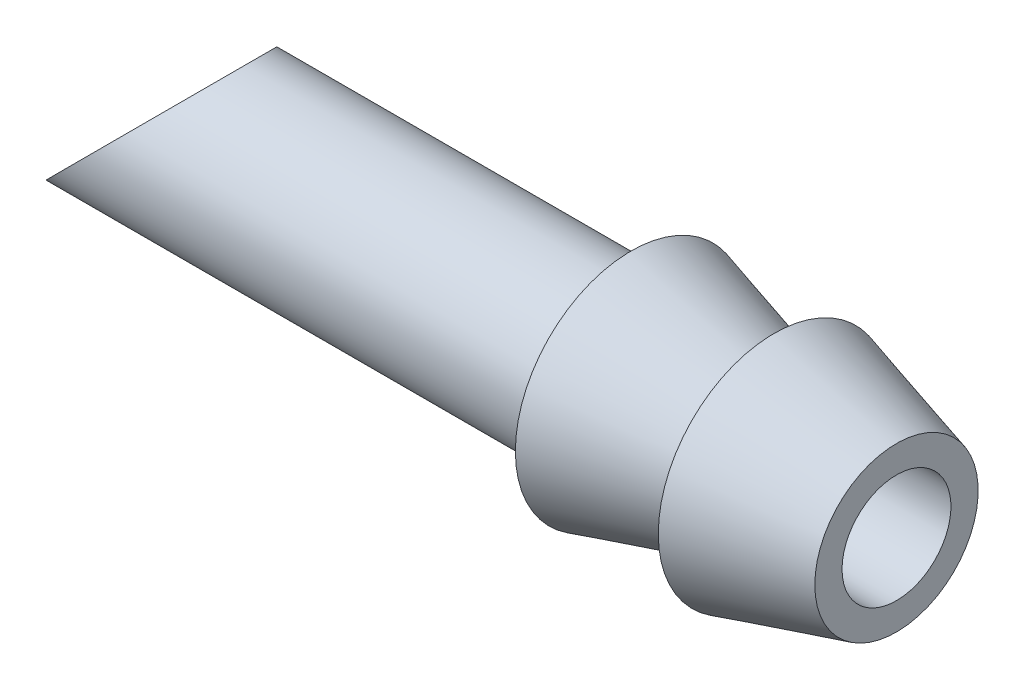
ISO-10303-21;
HEADER;
FILE_DESCRIPTION(('STEP AP214'),'2;1');
FILE_NAME('part.step','',(''),(''),'','','');
FILE_SCHEMA(('AUTOMOTIVE_DESIGN { 1 0 10303 214 1 1 1 1 }'));
ENDSEC;
DATA;
#1=APPLICATION_CONTEXT('core data for automotive mechanical design processes');
#2=APPLICATION_PROTOCOL_DEFINITION('international standard','automotive_design',2000,#1);
#3=PRODUCT_CONTEXT('',#1,'mechanical');
#4=PRODUCT('Part','Part','',(#3));
#5=PRODUCT_RELATED_PRODUCT_CATEGORY('part','',(#4));
#6=PRODUCT_DEFINITION_FORMATION('','',#4);
#7=PRODUCT_DEFINITION_CONTEXT('part definition',#1,'design');
#8=PRODUCT_DEFINITION('design','',#6,#7);
#9=PRODUCT_DEFINITION_SHAPE('','',#8);
#10=(LENGTH_UNIT() NAMED_UNIT(*) SI_UNIT(.MILLI.,.METRE.));
#11=(NAMED_UNIT(*) PLANE_ANGLE_UNIT() SI_UNIT($,.RADIAN.));
#12=(NAMED_UNIT(*) SI_UNIT($,.STERADIAN.) SOLID_ANGLE_UNIT());
#13=UNCERTAINTY_MEASURE_WITH_UNIT(LENGTH_MEASURE(1.E-05),#10,'distance_accuracy_value','');
#14=(GEOMETRIC_REPRESENTATION_CONTEXT(3) GLOBAL_UNCERTAINTY_ASSIGNED_CONTEXT((#13)) GLOBAL_UNIT_ASSIGNED_CONTEXT((#10,
#11,#12)) REPRESENTATION_CONTEXT('',''));
#15=CARTESIAN_POINT('',(0.,0.,0.));
#16=DIRECTION('',(0.,0.,1.));
#17=DIRECTION('',(1.,0.,0.));
#18=AXIS2_PLACEMENT_3D('',#15,#16,#17);
#19=CARTESIAN_POINT('',(0.,0.,0.));
#20=DIRECTION('',(-1.,0.,0.));
#21=DIRECTION('',(0.,0.,1.));
#22=AXIS2_PLACEMENT_3D('',#19,#20,#21);
#23=CYLINDRICAL_SURFACE('',#22,3.);
#24=CARTESIAN_POINT('',(2.99999999999997,0.,0.));
#25=DIRECTION('',(0.707106781186551,-0.707106781186544,0.));
#26=DIRECTION('',(-0.707106781186544,-0.707106781186551,0.));
#27=AXIS2_PLACEMENT_3D('',#24,#25,#26);
#28=ELLIPSE('',#27,4.24264068711926,3.);
#29=CARTESIAN_POINT('',(0.,-3.,0.));
#30=VERTEX_POINT('',#29);
#31=EDGE_CURVE('E72',#30,#30,#28,.T.);
#32=ORIENTED_EDGE('',*,*,#31,.T.);
#33=EDGE_LOOP('',(#32));
#34=FACE_BOUND('',#33,.T.);
#35=CARTESIAN_POINT('',(20.25,0.,0.));
#36=DIRECTION('',(-1.,0.,0.));
#37=DIRECTION('',(0.,0.,1.));
#38=AXIS2_PLACEMENT_3D('',#35,#36,#37);
#39=CIRCLE('',#38,3.);
#40=CARTESIAN_POINT('',(20.25,0.,3.));
#41=VERTEX_POINT('',#40);
#42=EDGE_CURVE('E68',#41,#41,#39,.T.);
#43=ORIENTED_EDGE('',*,*,#42,.T.);
#44=EDGE_LOOP('',(#43));
#45=FACE_BOUND('',#44,.T.);
#46=ADVANCED_FACE('F37',(#34,#45),#23,.T.);
#47=CARTESIAN_POINT('',(0.,0.,0.));
#48=DIRECTION('',(-1.,0.,0.));
#49=DIRECTION('',(0.,0.,1.));
#50=AXIS2_PLACEMENT_3D('',#47,#48,#49);
#51=CYLINDRICAL_SURFACE('',#50,2.);
#52=CARTESIAN_POINT('',(2.99999999999997,0.,0.));
#53=DIRECTION('',(0.707106781186551,-0.707106781186544,0.));
#54=DIRECTION('',(-0.707106781186544,-0.707106781186551,0.));
#55=AXIS2_PLACEMENT_3D('',#52,#53,#54);
#56=ELLIPSE('',#55,2.82842712474617,2.);
#57=CARTESIAN_POINT('',(0.999999999999991,-2.,0.));
#58=VERTEX_POINT('',#57);
#59=EDGE_CURVE('E40',#58,#58,#56,.F.);
#60=ORIENTED_EDGE('',*,*,#59,.T.);
#61=EDGE_LOOP('',(#60));
#62=FACE_BOUND('',#61,.T.);
#63=CARTESIAN_POINT('',(30.,0.,0.));
#64=DIRECTION('',(-1.,0.,0.));
#65=DIRECTION('',(0.,0.,1.));
#66=AXIS2_PLACEMENT_3D('',#63,#64,#65);
#67=CIRCLE('',#66,2.);
#68=CARTESIAN_POINT('',(30.,0.,2.));
#69=VERTEX_POINT('',#68);
#70=EDGE_CURVE('E10',#69,#69,#67,.T.);
#71=ORIENTED_EDGE('',*,*,#70,.F.);
#72=EDGE_LOOP('',(#71));
#73=FACE_BOUND('',#72,.T.);
#74=ADVANCED_FACE('F81',(#62,#73),#51,.F.);
#75=CARTESIAN_POINT('',(30.,3.,0.));
#76=DIRECTION('',(-1.,0.,0.));
#77=DIRECTION('',(0.,0.,1.));
#78=AXIS2_PLACEMENT_3D('',#75,#76,#77);
#79=PLANE('',#78);
#80=CARTESIAN_POINT('',(30.,0.,0.));
#81=DIRECTION('',(-1.,0.,0.));
#82=DIRECTION('',(0.,0.,1.));
#83=AXIS2_PLACEMENT_3D('',#80,#81,#82);
#84=CIRCLE('',#83,3.);
#85=CARTESIAN_POINT('',(30.,0.,3.));
#86=VERTEX_POINT('',#85);
#87=EDGE_CURVE('E45',#86,#86,#84,.T.);
#88=ORIENTED_EDGE('',*,*,#87,.F.);
#89=EDGE_LOOP('',(#88));
#90=FACE_BOUND('',#89,.T.);
#91=ORIENTED_EDGE('',*,*,#70,.T.);
#92=EDGE_LOOP('',(#91));
#93=FACE_BOUND('',#92,.T.);
#94=ADVANCED_FACE('F99',(#90,#93),#79,.F.);
#95=CARTESIAN_POINT('',(30.,0.,0.));
#96=DIRECTION('',(-1.,0.,0.));
#97=DIRECTION('',(0.,0.,1.));
#98=AXIS2_PLACEMENT_3D('',#95,#96,#97);
#99=CONICAL_SURFACE('',#98,3.,0.270946850338421);
#100=CARTESIAN_POINT('',(25.5,0.,0.));
#101=DIRECTION('',(-1.,0.,0.));
#102=DIRECTION('',(0.,0.,1.));
#103=AXIS2_PLACEMENT_3D('',#100,#101,#102);
#104=CIRCLE('',#103,4.25);
#105=CARTESIAN_POINT('',(25.5,0.,4.25));
#106=VERTEX_POINT('',#105);
#107=EDGE_CURVE('E50',#106,#106,#104,.T.);
#108=ORIENTED_EDGE('',*,*,#107,.F.);
#109=EDGE_LOOP('',(#108));
#110=FACE_BOUND('',#109,.T.);
#111=ORIENTED_EDGE('',*,*,#87,.T.);
#112=EDGE_LOOP('',(#111));
#113=FACE_BOUND('',#112,.T.);
#114=ADVANCED_FACE('F119',(#110,#113),#99,.T.);
#115=CARTESIAN_POINT('',(25.5,3.,0.));
#116=DIRECTION('',(1.,0.,0.));
#117=DIRECTION('',(0.,0.,-1.));
#118=AXIS2_PLACEMENT_3D('',#115,#116,#117);
#119=PLANE('',#118);
#120=CARTESIAN_POINT('',(25.5,0.,0.));
#121=DIRECTION('',(-1.,0.,0.));
#122=DIRECTION('',(0.,0.,1.));
#123=AXIS2_PLACEMENT_3D('',#120,#121,#122);
#124=CIRCLE('',#123,3.);
#125=CARTESIAN_POINT('',(25.5,0.,3.));
#126=VERTEX_POINT('',#125);
#127=EDGE_CURVE('E56',#126,#126,#124,.T.);
#128=ORIENTED_EDGE('',*,*,#127,.F.);
#129=EDGE_LOOP('',(#128));
#130=FACE_BOUND('',#129,.T.);
#131=ORIENTED_EDGE('',*,*,#107,.T.);
#132=EDGE_LOOP('',(#131));
#133=FACE_BOUND('',#132,.T.);
#134=ADVANCED_FACE('F113',(#130,#133),#119,.F.);
#135=CARTESIAN_POINT('',(0.,0.,0.));
#136=DIRECTION('',(-1.,0.,0.));
#137=DIRECTION('',(0.,0.,1.));
#138=AXIS2_PLACEMENT_3D('',#135,#136,#137);
#139=CYLINDRICAL_SURFACE('',#138,3.);
#140=CARTESIAN_POINT('',(24.75,0.,0.));
#141=DIRECTION('',(-1.,0.,0.));
#142=DIRECTION('',(0.,0.,1.));
#143=AXIS2_PLACEMENT_3D('',#140,#141,#142);
#144=CIRCLE('',#143,3.);
#145=CARTESIAN_POINT('',(24.75,0.,3.));
#146=VERTEX_POINT('',#145);
#147=EDGE_CURVE('E60',#146,#146,#144,.T.);
#148=ORIENTED_EDGE('',*,*,#147,.F.);
#149=EDGE_LOOP('',(#148));
#150=FACE_BOUND('',#149,.T.);
#151=ORIENTED_EDGE('',*,*,#127,.T.);
#152=EDGE_LOOP('',(#151));
#153=FACE_BOUND('',#152,.T.);
#154=ADVANCED_FACE('F107',(#150,#153),#139,.T.);
#155=CARTESIAN_POINT('',(24.75,0.,0.));
#156=DIRECTION('',(-1.,0.,0.));
#157=DIRECTION('',(0.,0.,1.));
#158=AXIS2_PLACEMENT_3D('',#155,#156,#157);
#159=CONICAL_SURFACE('',#158,3.,0.270946850338421);
#160=CARTESIAN_POINT('',(20.25,0.,0.));
#161=DIRECTION('',(-1.,0.,0.));
#162=DIRECTION('',(0.,0.,1.));
#163=AXIS2_PLACEMENT_3D('',#160,#161,#162);
#164=CIRCLE('',#163,4.25);
#165=CARTESIAN_POINT('',(20.25,0.,4.25));
#166=VERTEX_POINT('',#165);
#167=EDGE_CURVE('E64',#166,#166,#164,.T.);
#168=ORIENTED_EDGE('',*,*,#167,.F.);
#169=EDGE_LOOP('',(#168));
#170=FACE_BOUND('',#169,.T.);
#171=ORIENTED_EDGE('',*,*,#147,.T.);
#172=EDGE_LOOP('',(#171));
#173=FACE_BOUND('',#172,.T.);
#174=ADVANCED_FACE('F92',(#170,#173),#159,.T.);
#175=CARTESIAN_POINT('',(20.25,3.,0.));
#176=DIRECTION('',(1.,0.,0.));
#177=DIRECTION('',(0.,0.,-1.));
#178=AXIS2_PLACEMENT_3D('',#175,#176,#177);
#179=PLANE('',#178);
#180=ORIENTED_EDGE('',*,*,#42,.F.);
#181=EDGE_LOOP('',(#180));
#182=FACE_BOUND('',#181,.T.);
#183=ORIENTED_EDGE('',*,*,#167,.T.);
#184=EDGE_LOOP('',(#183));
#185=FACE_BOUND('',#184,.T.);
#186=ADVANCED_FACE('F87',(#182,#185),#179,.F.);
#187=CARTESIAN_POINT('',(0.,-3.,-5.));
#188=DIRECTION('',(0.707106781186551,-0.707106781186544,0.));
#189=DIRECTION('',(0.707106781186544,0.707106781186551,0.));
#190=AXIS2_PLACEMENT_3D('',#187,#188,#189);
#191=PLANE('',#190);
#192=ORIENTED_EDGE('',*,*,#59,.F.);
#193=EDGE_LOOP('',(#192));
#194=FACE_BOUND('',#193,.T.);
#195=ORIENTED_EDGE('',*,*,#31,.F.);
#196=EDGE_LOOP('',(#195));
#197=FACE_BOUND('',#196,.T.);
#198=ADVANCED_FACE('F84',(#194,#197),#191,.F.);
#199=CLOSED_SHELL('',(#46,#74,#94,#114,#134,#154,#174,#186,#198));
#200=MANIFOLD_SOLID_BREP('B2',#199);
#201=ADVANCED_BREP_SHAPE_REPRESENTATION('',(#18,#200),#14);
#202=SHAPE_DEFINITION_REPRESENTATION(#9,#201);
ENDSEC;
END-ISO-10303-21;
